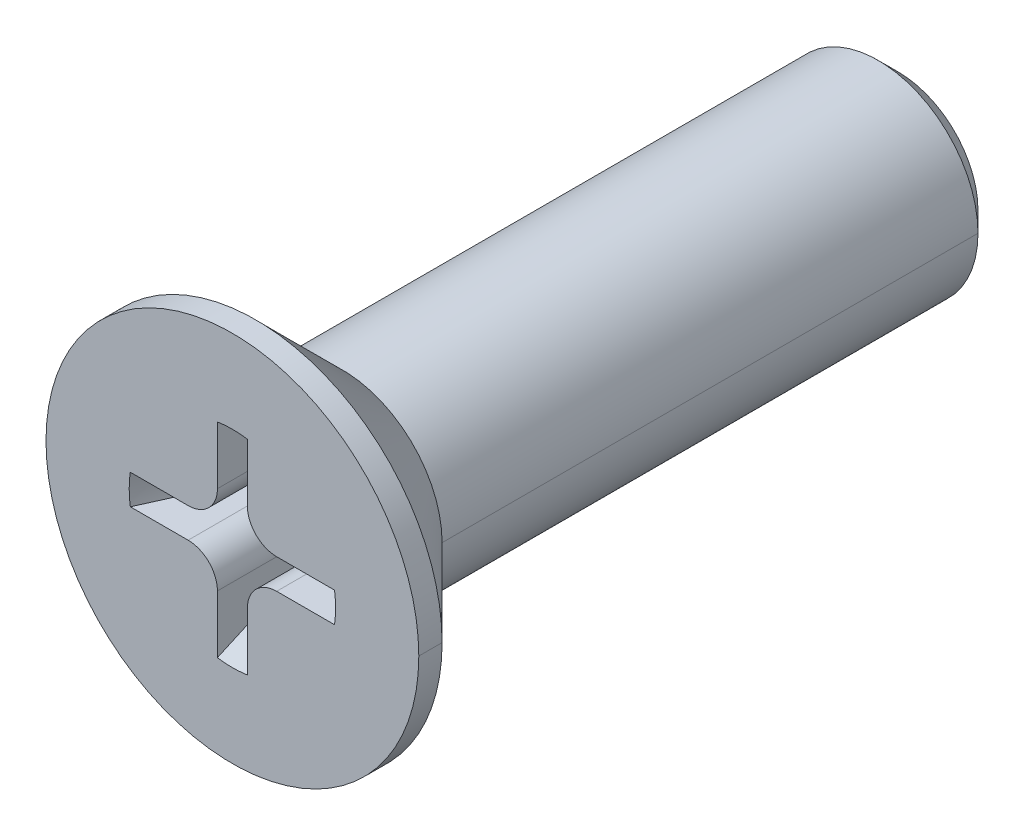
ISO-10303-21;
HEADER;
FILE_DESCRIPTION(('STEP AP214'),'2;1');
FILE_NAME('part.step','',(''),(''),'','','');
FILE_SCHEMA(('AUTOMOTIVE_DESIGN { 1 0 10303 214 1 1 1 1 }'));
ENDSEC;
DATA;
#1=APPLICATION_CONTEXT('core data for automotive mechanical design processes');
#2=APPLICATION_PROTOCOL_DEFINITION('international standard','automotive_design',2000,#1);
#3=PRODUCT_CONTEXT('',#1,'mechanical');
#4=PRODUCT('Part','Part','',(#3));
#5=PRODUCT_RELATED_PRODUCT_CATEGORY('part','',(#4));
#6=PRODUCT_DEFINITION_FORMATION('','',#4);
#7=PRODUCT_DEFINITION_CONTEXT('part definition',#1,'design');
#8=PRODUCT_DEFINITION('design','',#6,#7);
#9=PRODUCT_DEFINITION_SHAPE('','',#8);
#10=(LENGTH_UNIT() NAMED_UNIT(*) SI_UNIT(.MILLI.,.METRE.));
#11=(NAMED_UNIT(*) PLANE_ANGLE_UNIT() SI_UNIT($,.RADIAN.));
#12=(NAMED_UNIT(*) SI_UNIT($,.STERADIAN.) SOLID_ANGLE_UNIT());
#13=UNCERTAINTY_MEASURE_WITH_UNIT(LENGTH_MEASURE(1.E-05),#10,'distance_accuracy_value','');
#14=(GEOMETRIC_REPRESENTATION_CONTEXT(3) GLOBAL_UNCERTAINTY_ASSIGNED_CONTEXT((#13)) GLOBAL_UNIT_ASSIGNED_CONTEXT((#10,
#11,#12)) REPRESENTATION_CONTEXT('',''));
#15=CARTESIAN_POINT('',(0.,0.,0.));
#16=DIRECTION('',(0.,0.,1.));
#17=DIRECTION('',(1.,0.,0.));
#18=AXIS2_PLACEMENT_3D('',#15,#16,#17);
#19=CARTESIAN_POINT('',(0.,0.,1.65));
#20=DIRECTION('',(0.,0.,1.));
#21=DIRECTION('',(1.,0.,0.));
#22=AXIS2_PLACEMENT_3D('',#19,#20,#21);
#23=PLANE('',#22);
#24=CARTESIAN_POINT('',(0.665002947104029,-0.665002947104029,1.65));
#25=DIRECTION('',(0.,0.,-1.));
#26=DIRECTION('',(-0.999999999977569,6.69791883878349E-06,0.));
#27=AXIS2_PLACEMENT_3D('',#24,#25,#26);
#28=CIRCLE('',#27,0.440002947113898);
#29=CARTESIAN_POINT('',(0.225,-0.665,1.65));
#30=VERTEX_POINT('',#29);
#31=CARTESIAN_POINT('',(0.665,-0.225,1.65));
#32=VERTEX_POINT('',#31);
#33=EDGE_CURVE('E11',#30,#32,#28,.T.);
#34=ORIENTED_EDGE('',*,*,#33,.F.);
#35=DIRECTION('',(0.,1.,0.));
#36=VECTOR('',#35,1.);
#37=CARTESIAN_POINT('',(0.225,-1.5335824073065,1.65));
#38=LINE('',#37,#36);
#39=CARTESIAN_POINT('',(0.225000000000073,-1.53358240730625,1.6500000000001));
#40=VERTEX_POINT('',#39);
#41=EDGE_CURVE('E28',#40,#30,#38,.T.);
#42=ORIENTED_EDGE('',*,*,#41,.F.);
#43=CARTESIAN_POINT('',(-1.66239833898629E-07,2.27828530530161E-06,1.65));
#44=DIRECTION('',(0.,0.,1.));
#45=DIRECTION('',(1.07251348227272E-07,-1.,0.));
#46=AXIS2_PLACEMENT_3D('',#43,#44,#45);
#47=CIRCLE('',#46,1.55000227828531);
#48=CARTESIAN_POINT('',(0.,-1.55,1.65));
#49=VERTEX_POINT('',#48);
#50=EDGE_CURVE('E567',#49,#40,#47,.T.);
#51=ORIENTED_EDGE('',*,*,#50,.F.);
#52=CARTESIAN_POINT('',(1.6623987379727E-07,2.27828618171166E-06,1.65));
#53=DIRECTION('',(0.,0.,1.));
#54=DIRECTION('',(-0.145161184207195,-0.989408020282616,0.));
#55=AXIS2_PLACEMENT_3D('',#52,#53,#54);
#56=CIRCLE('',#55,1.55000227828619);
#57=CARTESIAN_POINT('',(-0.225,-1.53358240730663,1.65));
#58=VERTEX_POINT('',#57);
#59=EDGE_CURVE('E563',#58,#49,#56,.T.);
#60=ORIENTED_EDGE('',*,*,#59,.F.);
#61=DIRECTION('',(0.,-1.,0.));
#62=VECTOR('',#61,1.);
#63=CARTESIAN_POINT('',(-0.225,-0.665,1.65));
#64=LINE('',#63,#62);
#65=CARTESIAN_POINT('',(-0.225,-0.665,1.65));
#66=VERTEX_POINT('',#65);
#67=EDGE_CURVE('E558',#66,#58,#64,.T.);
#68=ORIENTED_EDGE('',*,*,#67,.F.);
#69=CARTESIAN_POINT('',(-0.665002947104029,-0.665002947104029,1.65));
#70=DIRECTION('',(0.,0.,-1.));
#71=DIRECTION('',(6.69791883878349E-06,0.999999999977569,0.));
#72=AXIS2_PLACEMENT_3D('',#69,#70,#71);
#73=CIRCLE('',#72,0.440002947113898);
#74=CARTESIAN_POINT('',(-0.665,-0.225,1.65));
#75=VERTEX_POINT('',#74);
#76=EDGE_CURVE('E550',#75,#66,#73,.T.);
#77=ORIENTED_EDGE('',*,*,#76,.F.);
#78=DIRECTION('',(1.,0.,0.));
#79=VECTOR('',#78,1.);
#80=CARTESIAN_POINT('',(-1.5335824073065,-0.225,1.65));
#81=LINE('',#80,#79);
#82=CARTESIAN_POINT('',(-1.53358240730626,-0.224999999999949,1.6500000000001));
#83=VERTEX_POINT('',#82);
#84=EDGE_CURVE('E559',#83,#75,#81,.T.);
#85=ORIENTED_EDGE('',*,*,#84,.F.);
#86=CARTESIAN_POINT('',(2.27828656429452E-06,1.66239900040166E-07,1.65));
#87=DIRECTION('',(0.,0.,1.));
#88=DIRECTION('',(-1.,-1.07251390899081E-07,0.));
#89=AXIS2_PLACEMENT_3D('',#86,#87,#88);
#90=CIRCLE('',#89,1.55000227828657);
#91=CARTESIAN_POINT('',(-1.55,0.,1.65));
#92=VERTEX_POINT('',#91);
#93=EDGE_CURVE('E611',#92,#83,#90,.T.);
#94=ORIENTED_EDGE('',*,*,#93,.F.);
#95=CARTESIAN_POINT('',(2.27828600740665E-06,-1.66239861106033E-07,1.65));
#96=DIRECTION('',(0.,0.,1.));
#97=DIRECTION('',(-0.989408020282614,0.145161184207203,0.));
#98=AXIS2_PLACEMENT_3D('',#95,#96,#97);
#99=CIRCLE('',#98,1.55000227828601);
#100=CARTESIAN_POINT('',(-1.53358240730663,0.225,1.65));
#101=VERTEX_POINT('',#100);
#102=EDGE_CURVE('E667',#101,#92,#99,.T.);
#103=ORIENTED_EDGE('',*,*,#102,.F.);
#104=DIRECTION('',(-1.,0.,0.));
#105=VECTOR('',#104,1.);
#106=CARTESIAN_POINT('',(-0.665,0.225,1.65));
#107=LINE('',#106,#105);
#108=CARTESIAN_POINT('',(-0.665,0.225,1.65));
#109=VERTEX_POINT('',#108);
#110=EDGE_CURVE('E190',#109,#101,#107,.T.);
#111=ORIENTED_EDGE('',*,*,#110,.F.);
#112=CARTESIAN_POINT('',(-0.665002947104029,0.665002947104029,1.65));
#113=DIRECTION('',(0.,0.,-1.));
#114=DIRECTION('',(0.999999999977569,-6.69791883954046E-06,0.));
#115=AXIS2_PLACEMENT_3D('',#112,#113,#114);
#116=CIRCLE('',#115,0.440002947113898);
#117=CARTESIAN_POINT('',(-0.225,0.665,1.65));
#118=VERTEX_POINT('',#117);
#119=EDGE_CURVE('E173',#118,#109,#116,.T.);
#120=ORIENTED_EDGE('',*,*,#119,.F.);
#121=DIRECTION('',(0.,-1.,0.));
#122=VECTOR('',#121,1.);
#123=CARTESIAN_POINT('',(-0.225,1.5335824073065,1.65));
#124=LINE('',#123,#122);
#125=CARTESIAN_POINT('',(-0.224999999999949,1.53358240730626,1.6500000000001));
#126=VERTEX_POINT('',#125);
#127=EDGE_CURVE('E180',#126,#118,#124,.T.);
#128=ORIENTED_EDGE('',*,*,#127,.F.);
#129=CARTESIAN_POINT('',(1.66239886884023E-07,-2.27828636334415E-06,1.65));
#130=DIRECTION('',(0.,0.,1.));
#131=DIRECTION('',(-1.07251382411274E-07,1.,0.));
#132=AXIS2_PLACEMENT_3D('',#129,#130,#131);
#133=CIRCLE('',#132,1.55000227828637);
#134=CARTESIAN_POINT('',(0.,1.55,1.65));
#135=VERTEX_POINT('',#134);
#136=EDGE_CURVE('E206',#135,#126,#133,.T.);
#137=ORIENTED_EDGE('',*,*,#136,.F.);
#138=CARTESIAN_POINT('',(-1.66239871111918E-07,-2.27828614463022E-06,1.65));
#139=DIRECTION('',(0.,0.,1.));
#140=DIRECTION('',(0.145161184207197,0.989408020282615,0.));
#141=AXIS2_PLACEMENT_3D('',#138,#139,#140);
#142=CIRCLE('',#141,1.55000227828615);
#143=CARTESIAN_POINT('',(0.225,1.53358240730663,1.65));
#144=VERTEX_POINT('',#143);
#145=EDGE_CURVE('E269',#144,#135,#142,.T.);
#146=ORIENTED_EDGE('',*,*,#145,.F.);
#147=DIRECTION('',(0.,1.,0.));
#148=VECTOR('',#147,1.);
#149=CARTESIAN_POINT('',(0.225,0.665,1.65));
#150=LINE('',#149,#148);
#151=CARTESIAN_POINT('',(0.225,0.665,1.65));
#152=VERTEX_POINT('',#151);
#153=EDGE_CURVE('E285',#152,#144,#150,.T.);
#154=ORIENTED_EDGE('',*,*,#153,.F.);
#155=CARTESIAN_POINT('',(0.665002947104029,0.665002947104029,1.65));
#156=DIRECTION('',(0.,0.,-1.));
#157=DIRECTION('',(-6.69791883878349E-06,-0.999999999977569,0.));
#158=AXIS2_PLACEMENT_3D('',#155,#156,#157);
#159=CIRCLE('',#158,0.440002947113898);
#160=CARTESIAN_POINT('',(0.665,0.225,1.65));
#161=VERTEX_POINT('',#160);
#162=EDGE_CURVE('E290',#161,#152,#159,.T.);
#163=ORIENTED_EDGE('',*,*,#162,.F.);
#164=DIRECTION('',(-1.,0.,0.));
#165=VECTOR('',#164,1.);
#166=CARTESIAN_POINT('',(1.5335824073065,0.225,1.65));
#167=LINE('',#166,#165);
#168=CARTESIAN_POINT('',(1.53358240730626,0.224999999999948,1.6500000000001));
#169=VERTEX_POINT('',#168);
#170=EDGE_CURVE('E751',#169,#161,#167,.T.);
#171=ORIENTED_EDGE('',*,*,#170,.F.);
#172=CARTESIAN_POINT('',(-2.27828557486376E-06,-1.66239852050776E-07,1.65));
#173=DIRECTION('',(0.,0.,1.));
#174=DIRECTION('',(1.,1.07251359938298E-07,0.));
#175=AXIS2_PLACEMENT_3D('',#172,#173,#174);
#176=CIRCLE('',#175,1.55000227828558);
#177=CARTESIAN_POINT('',(1.54999999999976,0.,1.6500000000001));
#178=VERTEX_POINT('',#177);
#179=EDGE_CURVE('E439',#178,#169,#176,.T.);
#180=ORIENTED_EDGE('',*,*,#179,.F.);
#181=CARTESIAN_POINT('',(-2.27828566146116E-06,1.66239860065198E-07,1.65));
#182=DIRECTION('',(0.,0.,1.));
#183=DIRECTION('',(0.98940802028261,-0.145161184207235,0.));
#184=AXIS2_PLACEMENT_3D('',#181,#182,#183);
#185=CIRCLE('',#184,1.55000227828567);
#186=CARTESIAN_POINT('',(1.53358240730663,-0.225,1.65));
#187=VERTEX_POINT('',#186);
#188=EDGE_CURVE('E452',#187,#178,#185,.T.);
#189=ORIENTED_EDGE('',*,*,#188,.F.);
#190=DIRECTION('',(1.,0.,0.));
#191=VECTOR('',#190,1.);
#192=CARTESIAN_POINT('',(0.665,-0.225,1.65));
#193=LINE('',#192,#191);
#194=EDGE_CURVE('E432',#32,#187,#193,.T.);
#195=ORIENTED_EDGE('',*,*,#194,.F.);
#196=EDGE_LOOP('',(#34,#42,#51,#60,#68,#77,#85,#94,#103,#111,#120,#128,#137,#146,#154,#163,#171,
#180,#189,#195));
#197=FACE_BOUND('',#196,.T.);
#198=CARTESIAN_POINT('',(0.,0.,1.65));
#199=DIRECTION('',(0.,0.,-1.));
#200=DIRECTION('',(1.,0.,0.));
#201=AXIS2_PLACEMENT_3D('',#198,#199,#200);
#202=CIRCLE('',#201,2.8);
#203=CARTESIAN_POINT('',(2.8,0.,1.65));
#204=VERTEX_POINT('',#203);
#205=CARTESIAN_POINT('',(-2.8,0.,1.65));
#206=VERTEX_POINT('',#205);
#207=EDGE_CURVE('E493',#204,#206,#202,.T.);
#208=ORIENTED_EDGE('',*,*,#207,.F.);
#209=CARTESIAN_POINT('',(0.,0.,1.65));
#210=DIRECTION('',(0.,0.,-1.));
#211=DIRECTION('',(-1.,0.,0.));
#212=AXIS2_PLACEMENT_3D('',#209,#210,#211);
#213=CIRCLE('',#212,2.8);
#214=EDGE_CURVE('E756',#206,#204,#213,.T.);
#215=ORIENTED_EDGE('',*,*,#214,.F.);
#216=EDGE_LOOP('',(#208,#215));
#217=FACE_BOUND('',#216,.T.);
#218=ADVANCED_FACE('F16',(#197,#217),#23,.T.);
#219=CARTESIAN_POINT('',(0.665,-0.665,-0.35));
#220=DIRECTION('',(0.,0.,1.));
#221=DIRECTION('',(1.,0.,0.));
#222=AXIS2_PLACEMENT_3D('',#219,#220,#221);
#223=CYLINDRICAL_SURFACE('',#222,0.44);
#224=CARTESIAN_POINT('',(0.664977290622323,-0.664977284049897,-0.35));
#225=DIRECTION('',(0.,0.,-1.));
#226=DIRECTION('',(0.707206493192012,0.707007055118304,0.));
#227=AXIS2_PLACEMENT_3D('',#224,#225,#226);
#228=ELLIPSE('',#227,0.439987856251335,0.439966630410505);
#229=CARTESIAN_POINT('',(0.227347754998727,-0.619607132219182,-0.35));
#230=VERTEX_POINT('',#229);
#231=CARTESIAN_POINT('',(0.61960713221919,-0.227347754998725,-0.35));
#232=VERTEX_POINT('',#231);
#233=EDGE_CURVE('E515',#230,#232,#228,.T.);
#234=ORIENTED_EDGE('',*,*,#233,.F.);
#235=CARTESIAN_POINT('',(0.225,-0.665,-0.25554435333));
#236=CARTESIAN_POINT('',(0.224997576697149,-0.659979084863247,-0.266245692639492));
#237=CARTESIAN_POINT('',(0.225172019705936,-0.649944923213804,-0.287458425731368));
#238=CARTESIAN_POINT('',(0.225948390210975,-0.634807892123544,-0.318947527727684));
#239=CARTESIAN_POINT('',(0.226825283704914,-0.624669289093572,-0.339712037566667));
#240=CARTESIAN_POINT('',(0.227347754998772,-0.619607132218977,-0.35));
#241=(BOUNDED_CURVE() B_SPLINE_CURVE(3,(#235,#236,#237,#238,#239,#240),.UNSPECIFIED.,.F.,
.F.) B_SPLINE_CURVE_WITH_KNOTS((4,1,1,4),(0.,0.338238737453003,0.671572101189784,1.),
.UNSPECIFIED.) CURVE() GEOMETRIC_REPRESENTATION_ITEM() RATIONAL_B_SPLINE_CURVE((1.,1.,1.,1.,1.,1.)) REPRESENTATION_ITEM(''));
#242=CARTESIAN_POINT('',(0.225000000000029,-0.664999999998303,-0.255544353333499));
#243=VERTEX_POINT('',#242);
#244=EDGE_CURVE('E353',#243,#230,#241,.T.);
#245=ORIENTED_EDGE('',*,*,#244,.F.);
#246=DIRECTION('',(0.,0.,-1.));
#247=VECTOR('',#246,1.);
#248=CARTESIAN_POINT('',(0.225,-0.665,1.65));
#249=LINE('',#248,#247);
#250=EDGE_CURVE('E715',#30,#243,#249,.T.);
#251=ORIENTED_EDGE('',*,*,#250,.F.);
#252=ORIENTED_EDGE('',*,*,#33,.T.);
#253=DIRECTION('',(0.,0.,1.));
#254=VECTOR('',#253,1.);
#255=CARTESIAN_POINT('',(0.665,-0.225,-0.25554435333));
#256=LINE('',#255,#254);
#257=CARTESIAN_POINT('',(0.665,-0.225,-0.255544353330121));
#258=VERTEX_POINT('',#257);
#259=EDGE_CURVE('E422',#258,#32,#256,.T.);
#260=ORIENTED_EDGE('',*,*,#259,.F.);
#261=CARTESIAN_POINT('',(0.619607132218976,-0.227347754998772,-0.35));
#262=CARTESIAN_POINT('',(0.624669289093211,-0.226825283704952,-0.33971203756746));
#263=CARTESIAN_POINT('',(0.634807892122837,-0.22594839021103,-0.318947527729279));
#264=CARTESIAN_POINT('',(0.649944923213095,-0.225172019705954,-0.287458425732962));
#265=CARTESIAN_POINT('',(0.659979084862893,-0.224997576697149,-0.266245692640291));
#266=CARTESIAN_POINT('',(0.665,-0.225,-0.25554435333));
#267=(BOUNDED_CURVE() B_SPLINE_CURVE(3,(#261,#262,#263,#264,#265,#266),.UNSPECIFIED.,.F.,
.F.) B_SPLINE_CURVE_WITH_KNOTS((4,1,1,4),(0.,0.328427898785266,0.66176126252203,1.),
.UNSPECIFIED.) CURVE() GEOMETRIC_REPRESENTATION_ITEM() RATIONAL_B_SPLINE_CURVE((1.,1.,1.,1.,1.,1.)) REPRESENTATION_ITEM(''));
#268=EDGE_CURVE('E435',#232,#258,#267,.T.);
#269=ORIENTED_EDGE('',*,*,#268,.F.);
#270=EDGE_LOOP('',(#234,#245,#251,#252,#260,#269));
#271=FACE_BOUND('',#270,.T.);
#272=ADVANCED_FACE('F324',(#271),#223,.T.);
#273=CARTESIAN_POINT('',(0.225,-0.665,-0.35));
#274=DIRECTION('',(1.,0.,0.));
#275=DIRECTION('',(0.,-1.,0.));
#276=AXIS2_PLACEMENT_3D('',#273,#274,#275);
#277=PLANE('',#276);
#278=ORIENTED_EDGE('',*,*,#41,.T.);
#279=ORIENTED_EDGE('',*,*,#250,.T.);
#280=CARTESIAN_POINT('',(0.225,-0.664999999994907,-0.255544353340496));
#281=CARTESIAN_POINT('',(0.225,-0.953818236801985,0.360428957635525));
#282=CARTESIAN_POINT('',(0.225,-1.53358240730574,1.65000000000032));
#283=B_SPLINE_CURVE_WITH_KNOTS('',2,(#280,#281,#282),.UNSPECIFIED.,.F.,.F.,(3,3),(0.,1.),.UNSPECIFIED.);
#284=EDGE_CURVE('E348',#243,#40,#283,.T.);
#285=ORIENTED_EDGE('',*,*,#284,.T.);
#286=EDGE_LOOP('',(#278,#279,#285));
#287=FACE_BOUND('',#286,.T.);
#288=ADVANCED_FACE('F325',(#287),#277,.F.);
#289=CARTESIAN_POINT('',(0.,0.,0.414044943820969));
#290=DIRECTION('',(0.,0.,1.));
#291=DIRECTION('',(1.,0.,0.));
#292=AXIS2_PLACEMENT_3D('',#289,#290,#291);
#293=CONICAL_SURFACE('',#292,1.,0.418688151438);
#294=ORIENTED_EDGE('',*,*,#244,.T.);
#295=CARTESIAN_POINT('',(0.,9.42262228875723E-06,-0.35));
#296=DIRECTION('',(0.,0.,1.));
#297=DIRECTION('',(-0.344461678646605,-0.938800379177577,0.));
#298=AXIS2_PLACEMENT_3D('',#295,#296,#297);
#299=CIRCLE('',#298,0.660008845953364);
#300=CARTESIAN_POINT('',(-0.227347754998727,-0.619607132219182,-0.35));
#301=VERTEX_POINT('',#300);
#302=EDGE_CURVE('E518',#301,#230,#299,.T.);
#303=ORIENTED_EDGE('',*,*,#302,.F.);
#304=CARTESIAN_POINT('',(-0.227347754998772,-0.619607132218976,-0.35));
#305=CARTESIAN_POINT('',(-0.226825283760521,-0.624669288381268,-0.339712037031239));
#306=CARTESIAN_POINT('',(-0.225948390346928,-0.634807890420636,-0.318947526519808));
#307=CARTESIAN_POINT('',(-0.225172019745341,-0.64994492151478,-0.287458424544833));
#308=CARTESIAN_POINT('',(-0.224997576715422,-0.659979084138568,-0.266245692105085));
#309=CARTESIAN_POINT('',(-0.225,-0.665,-0.25554435333));
#310=(BOUNDED_CURVE() B_SPLINE_CURVE(3,(#304,#305,#306,#307,#308,#309),.UNSPECIFIED.,.F.,
.F.) B_SPLINE_CURVE_WITH_KNOTS((4,1,1,4),(0.,0.328427903650265,0.66176126742425,1.),
.UNSPECIFIED.) CURVE() GEOMETRIC_REPRESENTATION_ITEM() RATIONAL_B_SPLINE_CURVE((1.,1.,1.,1.,1.,1.)) REPRESENTATION_ITEM(''));
#311=CARTESIAN_POINT('',(-0.225,-0.665,-0.255544353330121));
#312=VERTEX_POINT('',#311);
#313=EDGE_CURVE('E390',#301,#312,#310,.T.);
#314=ORIENTED_EDGE('',*,*,#313,.T.);
#315=CARTESIAN_POINT('',(-0.224999999999924,-0.664999999999773,-0.255544353330256));
#316=CARTESIAN_POINT('',(-0.225039547884392,-0.695465103759759,-0.190642415406481));
#317=CARTESIAN_POINT('',(-0.225087318401698,-0.725771368511061,-0.125666353264263));
#318=CARTESIAN_POINT('',(-0.225172119461064,-0.790511529117318,0.0138056822562831));
#319=CARTESIAN_POINT('',(-0.225206596269187,-0.824908244460088,0.0883189252409818));
#320=CARTESIAN_POINT('',(-0.225204503546371,-0.897841203921313,0.246862718118498));
#321=CARTESIAN_POINT('',(-0.225158400079613,-0.936350967044348,0.330905428113313));
#322=CARTESIAN_POINT('',(-0.225060729834554,-1.0174906776052,0.508514744546113));
#323=CARTESIAN_POINT('',(-0.22500913059015,-1.0600979976751,0.602091686644455));
#324=CARTESIAN_POINT('',(-0.224992586721939,-1.13435090645116,0.765576187106801));
#325=CARTESIAN_POINT('',(-0.225008980000664,-1.16603530920568,0.835466128966097));
#326=CARTESIAN_POINT('',(-0.225030966203751,-1.2322285782042,0.981666557942102));
#327=CARTESIAN_POINT('',(-0.225035434987474,-1.26673090169162,1.05798000694171));
#328=CARTESIAN_POINT('',(-0.225033200572356,-1.33855861884455,1.21702848478205));
#329=CARTESIAN_POINT('',(-0.225025530336253,-1.37587843341487,1.29976603261192));
#330=CARTESIAN_POINT('',(-0.225009317244668,-1.45333851249301,1.47166356355233));
#331=CARTESIAN_POINT('',(-0.225000752760716,-1.49347386583979,1.56082575994557));
#332=CARTESIAN_POINT('',(-0.224999999999854,-1.53358240730586,1.65000000000047));
#333=B_SPLINE_CURVE_WITH_KNOTS('',3,(#315,#316,#317,#318,#319,#320,#321,#322,#323,#324,#325,
#326,#327,#328,#329,#330,#331,#332),.UNSPECIFIED.,.F.,.F.,(4,2,2,2,2,2,2,2,4),(0.,
0.215088673233473,0.461295740035169,0.738632158647098,1.04709300891456,1.27730275845856,
1.528554337442,1.80084906647282,2.09418619594322),.UNSPECIFIED.);
#334=EDGE_CURVE('E384',#312,#58,#333,.T.);
#335=ORIENTED_EDGE('',*,*,#334,.T.);
#336=ORIENTED_EDGE('',*,*,#59,.T.);
#337=ORIENTED_EDGE('',*,*,#50,.T.);
#338=ORIENTED_EDGE('',*,*,#284,.F.);
#339=EDGE_LOOP('',(#294,#303,#314,#335,#336,#337,#338));
#340=FACE_BOUND('',#339,.T.);
#341=ADVANCED_FACE('F329',(#340),#293,.F.);
#342=CARTESIAN_POINT('',(-0.225,-1.55,-0.35));
#343=DIRECTION('',(-1.,0.,0.));
#344=DIRECTION('',(0.,1.,0.));
#345=AXIS2_PLACEMENT_3D('',#342,#343,#344);
#346=PLANE('',#345);
#347=DIRECTION('',(0.,0.,1.));
#348=VECTOR('',#347,1.);
#349=CARTESIAN_POINT('',(-0.225,-0.665,-0.25554435333));
#350=LINE('',#349,#348);
#351=EDGE_CURVE('E553',#312,#66,#350,.T.);
#352=ORIENTED_EDGE('',*,*,#351,.T.);
#353=ORIENTED_EDGE('',*,*,#67,.T.);
#354=ORIENTED_EDGE('',*,*,#334,.F.);
#355=EDGE_LOOP('',(#352,#353,#354));
#356=FACE_BOUND('',#355,.T.);
#357=ADVANCED_FACE('F363',(#356),#346,.F.);
#358=CARTESIAN_POINT('',(-0.665,-0.665,-0.35));
#359=DIRECTION('',(0.,0.,1.));
#360=DIRECTION('',(1.,0.,0.));
#361=AXIS2_PLACEMENT_3D('',#358,#359,#360);
#362=CYLINDRICAL_SURFACE('',#361,0.44);
#363=CARTESIAN_POINT('',(-0.664977284049885,-0.664977290622295,-0.35));
#364=DIRECTION('',(0.,0.,-1.));
#365=DIRECTION('',(-0.707007055318739,0.707206492991634,0.));
#366=AXIS2_PLACEMENT_3D('',#363,#364,#365);
#367=ELLIPSE('',#366,0.439987856251323,0.439966630410477);
#368=CARTESIAN_POINT('',(-0.61960713221919,-0.227347754998725,-0.35));
#369=VERTEX_POINT('',#368);
#370=EDGE_CURVE('E477',#369,#301,#367,.T.);
#371=ORIENTED_EDGE('',*,*,#370,.F.);
#372=CARTESIAN_POINT('',(-0.665,-0.225,-0.25554435333));
#373=CARTESIAN_POINT('',(-0.659979084863405,-0.224997576697145,-0.266245692639615));
#374=CARTESIAN_POINT('',(-0.649944923214177,-0.225172019705928,-0.287458425731638));
#375=CARTESIAN_POINT('',(-0.634807892123958,-0.225948390210943,-0.318947527727979));
#376=CARTESIAN_POINT('',(-0.624669289093746,-0.2268252837049,-0.339712037566797));
#377=CARTESIAN_POINT('',(-0.619607132218977,-0.227347754998772,-0.35));
#378=(BOUNDED_CURVE() B_SPLINE_CURVE(3,(#372,#373,#374,#375,#376,#377),.UNSPECIFIED.,.F.,
.F.) B_SPLINE_CURVE_WITH_KNOTS((4,1,1,4),(0.,0.338238737454223,0.671572101190959,1.),
.UNSPECIFIED.) CURVE() GEOMETRIC_REPRESENTATION_ITEM() RATIONAL_B_SPLINE_CURVE((1.,1.,1.,1.,1.,1.)) REPRESENTATION_ITEM(''));
#379=CARTESIAN_POINT('',(-0.665000000000185,-0.224999999999983,-0.255544353329524));
#380=VERTEX_POINT('',#379);
#381=EDGE_CURVE('E603',#380,#369,#378,.T.);
#382=ORIENTED_EDGE('',*,*,#381,.F.);
#383=DIRECTION('',(0.,0.,-1.));
#384=VECTOR('',#383,1.);
#385=CARTESIAN_POINT('',(-0.665,-0.225,1.65));
#386=LINE('',#385,#384);
#387=EDGE_CURVE('E555',#75,#380,#386,.T.);
#388=ORIENTED_EDGE('',*,*,#387,.F.);
#389=ORIENTED_EDGE('',*,*,#76,.T.);
#390=ORIENTED_EDGE('',*,*,#351,.F.);
#391=ORIENTED_EDGE('',*,*,#313,.F.);
#392=EDGE_LOOP('',(#371,#382,#388,#389,#390,#391));
#393=FACE_BOUND('',#392,.T.);
#394=ADVANCED_FACE('F401',(#393),#362,.T.);
#395=CARTESIAN_POINT('',(-0.665,-0.225,-0.35));
#396=DIRECTION('',(0.,-1.,0.));
#397=DIRECTION('',(-1.,0.,0.));
#398=AXIS2_PLACEMENT_3D('',#395,#396,#397);
#399=PLANE('',#398);
#400=ORIENTED_EDGE('',*,*,#84,.T.);
#401=ORIENTED_EDGE('',*,*,#387,.T.);
#402=CARTESIAN_POINT('',(-0.665000000000556,-0.225,-0.255544353328571));
#403=CARTESIAN_POINT('',(-0.953818236804416,-0.225,0.360428957641391));
#404=CARTESIAN_POINT('',(-1.53358240730579,-0.225,1.65000000000032));
#405=B_SPLINE_CURVE_WITH_KNOTS('',2,(#402,#403,#404),.UNSPECIFIED.,.F.,.F.,(3,3),(0.,1.),.UNSPECIFIED.);
#406=EDGE_CURVE('E587',#380,#83,#405,.T.);
#407=ORIENTED_EDGE('',*,*,#406,.T.);
#408=EDGE_LOOP('',(#400,#401,#407));
#409=FACE_BOUND('',#408,.T.);
#410=ADVANCED_FACE('F320',(#409),#399,.F.);
#411=CARTESIAN_POINT('',(0.,0.,0.414044943820969));
#412=DIRECTION('',(0.,0.,1.));
#413=DIRECTION('',(1.,0.,0.));
#414=AXIS2_PLACEMENT_3D('',#411,#412,#413);
#415=CONICAL_SURFACE('',#414,1.,0.418688151438);
#416=ORIENTED_EDGE('',*,*,#93,.T.);
#417=ORIENTED_EDGE('',*,*,#406,.F.);
#418=ORIENTED_EDGE('',*,*,#381,.T.);
#419=CARTESIAN_POINT('',(5.59334874616901E-06,9.93770143703499E-07,-0.35));
#420=DIRECTION('',(0.,0.,1.));
#421=DIRECTION('',(-0.999999999998867,-1.50569957848413E-06,0.));
#422=AXIS2_PLACEMENT_3D('',#419,#420,#421);
#423=CIRCLE('',#422,0.660005593349494);
#424=CARTESIAN_POINT('',(-0.66,0.,-0.35));
#425=VERTEX_POINT('',#424);
#426=EDGE_CURVE('E474',#425,#369,#423,.T.);
#427=ORIENTED_EDGE('',*,*,#426,.F.);
#428=CARTESIAN_POINT('',(5.59334928773581E-06,-9.93770240036163E-07,-0.35));
#429=DIRECTION('',(0.,0.,1.));
#430=DIRECTION('',(-0.93879920384246,0.344464881903458,0.));
#431=AXIS2_PLACEMENT_3D('',#428,#429,#430);
#432=CIRCLE('',#431,0.660005593350036);
#433=CARTESIAN_POINT('',(-0.61960713221919,0.227347754998725,-0.35));
#434=VERTEX_POINT('',#433);
#435=EDGE_CURVE('E468',#434,#425,#432,.T.);
#436=ORIENTED_EDGE('',*,*,#435,.F.);
#437=CARTESIAN_POINT('',(-0.619607132218976,0.227347754998772,-0.35));
#438=CARTESIAN_POINT('',(-0.624669289093226,0.22682528370495,-0.339712037567471));
#439=CARTESIAN_POINT('',(-0.634807892122873,0.225948390211027,-0.318947527729304));
#440=CARTESIAN_POINT('',(-0.649944923213123,0.225172019705953,-0.287458425732984));
#441=CARTESIAN_POINT('',(-0.659979084862905,0.224997576697148,-0.266245692640301));
#442=CARTESIAN_POINT('',(-0.665,0.225,-0.25554435333));
#443=(BOUNDED_CURVE() B_SPLINE_CURVE(3,(#437,#438,#439,#440,#441,#442),.UNSPECIFIED.,.F.,
.F.) B_SPLINE_CURVE_WITH_KNOTS((4,1,1,4),(0.,0.328427898785164,0.661761262521922,1.),
.UNSPECIFIED.) CURVE() GEOMETRIC_REPRESENTATION_ITEM() RATIONAL_B_SPLINE_CURVE((1.,1.,1.,1.,1.,1.)) REPRESENTATION_ITEM(''));
#444=CARTESIAN_POINT('',(-0.665,0.225,-0.255544353330121));
#445=VERTEX_POINT('',#444);
#446=EDGE_CURVE('E612',#434,#445,#443,.T.);
#447=ORIENTED_EDGE('',*,*,#446,.T.);
#448=CARTESIAN_POINT('',(-0.664999999999774,0.224999999999922,-0.255544353330256));
#449=CARTESIAN_POINT('',(-0.695465103761088,0.225039547884359,-0.190642415403678));
#450=CARTESIAN_POINT('',(-0.725771368513724,0.225087318401547,-0.125666353258659));
#451=CARTESIAN_POINT('',(-0.790511529121772,0.225172119460607,0.0138056822656223));
#452=CARTESIAN_POINT('',(-0.824908244465006,0.22520659626853,0.0883189252512523));
#453=CARTESIAN_POINT('',(-0.897841203926261,0.225204503545415,0.246862718128763));
#454=CARTESIAN_POINT('',(-0.936350967048863,0.225158400078574,0.330905428122642));
#455=CARTESIAN_POINT('',(-1.01749067760791,0.225060729833784,0.508514744551711));
#456=CARTESIAN_POINT('',(-1.06009799767645,0.225009130589783,0.602091686647258));
#457=CARTESIAN_POINT('',(-1.13435090645409,0.224992586722209,0.765576187113372));
#458=CARTESIAN_POINT('',(-1.16603530921154,0.225008980001189,0.83546612897924));
#459=CARTESIAN_POINT('',(-1.23222857821397,0.225030966204482,0.981666557964005));
#460=CARTESIAN_POINT('',(-1.26673090170239,0.225035434988126,1.0579800069658));
#461=CARTESIAN_POINT('',(-1.33855861885534,0.225033200572799,1.21702848480614));
#462=CARTESIAN_POINT('',(-1.37587843342469,0.225025530336564,1.29976603263382));
#463=CARTESIAN_POINT('',(-1.45333851249891,0.225009317244753,1.47166356356547));
#464=CARTESIAN_POINT('',(-1.49347386584275,0.225000752760711,1.56082575995214));
#465=CARTESIAN_POINT('',(-1.53358240730586,0.224999999999844,1.65000000000047));
#466=B_SPLINE_CURVE_WITH_KNOTS('',3,(#448,#449,#450,#451,#452,#453,#454,#455,#456,#457,#458,
#459,#460,#461,#462,#463,#464,#465),.UNSPECIFIED.,.F.,.F.,(4,2,2,2,2,2,2,2,4),(0.,
0.215088673242779,0.461295740047595,0.738632158656429,1.04709300891456,1.27730275848015,
1.52855433747079,1.80084906649442,2.09418619594322),.UNSPECIFIED.);
#467=EDGE_CURVE('E636',#445,#101,#466,.T.);
#468=ORIENTED_EDGE('',*,*,#467,.T.);
#469=ORIENTED_EDGE('',*,*,#102,.T.);
#470=EDGE_LOOP('',(#416,#417,#418,#427,#436,#447,#468,#469));
#471=FACE_BOUND('',#470,.T.);
#472=ADVANCED_FACE('F364',(#471),#415,.F.);
#473=CARTESIAN_POINT('',(-1.55,0.225,-0.35));
#474=DIRECTION('',(0.,1.,0.));
#475=DIRECTION('',(1.,0.,0.));
#476=AXIS2_PLACEMENT_3D('',#473,#474,#475);
#477=PLANE('',#476);
#478=DIRECTION('',(0.,0.,1.));
#479=VECTOR('',#478,1.);
#480=CARTESIAN_POINT('',(-0.665,0.225,-0.25554435333));
#481=LINE('',#480,#479);
#482=EDGE_CURVE('E661',#445,#109,#481,.T.);
#483=ORIENTED_EDGE('',*,*,#482,.T.);
#484=ORIENTED_EDGE('',*,*,#110,.T.);
#485=ORIENTED_EDGE('',*,*,#467,.F.);
#486=EDGE_LOOP('',(#483,#484,#485));
#487=FACE_BOUND('',#486,.T.);
#488=ADVANCED_FACE('F412',(#487),#477,.F.);
#489=CARTESIAN_POINT('',(-0.665,0.665,-0.35));
#490=DIRECTION('',(0.,0.,1.));
#491=DIRECTION('',(1.,0.,0.));
#492=AXIS2_PLACEMENT_3D('',#489,#490,#491);
#493=CYLINDRICAL_SURFACE('',#492,0.44);
#494=CARTESIAN_POINT('',(-0.664977290622325,0.6649772840499,-0.35));
#495=DIRECTION('',(0.,0.,-1.));
#496=DIRECTION('',(0.707206493193319,0.707007055116997,0.));
#497=AXIS2_PLACEMENT_3D('',#494,#495,#496);
#498=ELLIPSE('',#497,0.439987856251336,0.439966630410509);
#499=CARTESIAN_POINT('',(-0.227347754998727,0.619607132219182,-0.35));
#500=VERTEX_POINT('',#499);
#501=EDGE_CURVE('E768',#500,#434,#498,.T.);
#502=ORIENTED_EDGE('',*,*,#501,.F.);
#503=CARTESIAN_POINT('',(-0.225,0.665,-0.25554435333));
#504=CARTESIAN_POINT('',(-0.22499757669745,0.659979084851298,-0.266245692630642));
#505=CARTESIAN_POINT('',(-0.225172019706584,0.649944923185782,-0.287458425711728));
#506=CARTESIAN_POINT('',(-0.225948390213228,0.634807892095306,-0.318947527707617));
#507=CARTESIAN_POINT('',(-0.226825283705835,0.62466928908176,-0.339712037557772));
#508=CARTESIAN_POINT('',(-0.227347754998772,0.619607132218977,-0.35));
#509=(BOUNDED_CURVE() B_SPLINE_CURVE(3,(#503,#504,#505,#506,#507,#508),.UNSPECIFIED.,.F.,
.F.) B_SPLINE_CURVE_WITH_KNOTS((4,1,1,4),(0.,0.338238737371578,0.671572101109111,1.),
.UNSPECIFIED.) CURVE() GEOMETRIC_REPRESENTATION_ITEM() RATIONAL_B_SPLINE_CURVE((1.,1.,1.,1.,1.,1.)) REPRESENTATION_ITEM(''));
#510=CARTESIAN_POINT('',(-0.224999999999983,0.66500000000018,-0.255544353329535));
#511=VERTEX_POINT('',#510);
#512=EDGE_CURVE('E198',#511,#500,#509,.T.);
#513=ORIENTED_EDGE('',*,*,#512,.F.);
#514=DIRECTION('',(0.,0.,-1.));
#515=VECTOR('',#514,1.);
#516=CARTESIAN_POINT('',(-0.225,0.665,1.65));
#517=LINE('',#516,#515);
#518=EDGE_CURVE('E181',#118,#511,#517,.T.);
#519=ORIENTED_EDGE('',*,*,#518,.F.);
#520=ORIENTED_EDGE('',*,*,#119,.T.);
#521=ORIENTED_EDGE('',*,*,#482,.F.);
#522=ORIENTED_EDGE('',*,*,#446,.F.);
#523=EDGE_LOOP('',(#502,#513,#519,#520,#521,#522));
#524=FACE_BOUND('',#523,.T.);
#525=ADVANCED_FACE('F196',(#524),#493,.T.);
#526=CARTESIAN_POINT('',(-0.225,0.665,-0.35));
#527=DIRECTION('',(-1.,0.,0.));
#528=DIRECTION('',(0.,1.,0.));
#529=AXIS2_PLACEMENT_3D('',#526,#527,#528);
#530=PLANE('',#529);
#531=ORIENTED_EDGE('',*,*,#127,.T.);
#532=ORIENTED_EDGE('',*,*,#518,.T.);
#533=CARTESIAN_POINT('',(-0.225,0.66500000000054,-0.255544353328605));
#534=CARTESIAN_POINT('',(-0.225,0.953818236804248,0.360428957641035));
#535=CARTESIAN_POINT('',(-0.225,1.53358240730579,1.65000000000032));
#536=B_SPLINE_CURVE_WITH_KNOTS('',2,(#533,#534,#535),.UNSPECIFIED.,.F.,.F.,(3,3),(0.,1.),.UNSPECIFIED.);
#537=EDGE_CURVE('E183',#511,#126,#536,.T.);
#538=ORIENTED_EDGE('',*,*,#537,.T.);
#539=EDGE_LOOP('',(#531,#532,#538));
#540=FACE_BOUND('',#539,.T.);
#541=ADVANCED_FACE('F18',(#540),#530,.F.);
#542=CARTESIAN_POINT('',(0.,0.,0.414044943820969));
#543=DIRECTION('',(0.,0.,1.));
#544=DIRECTION('',(1.,0.,0.));
#545=AXIS2_PLACEMENT_3D('',#542,#543,#544);
#546=CONICAL_SURFACE('',#545,1.,0.418688151438);
#547=ORIENTED_EDGE('',*,*,#136,.T.);
#548=ORIENTED_EDGE('',*,*,#537,.F.);
#549=ORIENTED_EDGE('',*,*,#512,.T.);
#550=CARTESIAN_POINT('',(0.,-9.42262228786905E-06,-0.35));
#551=DIRECTION('',(0.,0.,1.));
#552=DIRECTION('',(0.344461678646606,0.938800379177577,0.));
#553=AXIS2_PLACEMENT_3D('',#550,#551,#552);
#554=CIRCLE('',#553,0.660008845953363);
#555=CARTESIAN_POINT('',(0.227347754998727,0.619607132219182,-0.35));
#556=VERTEX_POINT('',#555);
#557=EDGE_CURVE('E514',#556,#500,#554,.T.);
#558=ORIENTED_EDGE('',*,*,#557,.F.);
#559=CARTESIAN_POINT('',(0.227347754998772,0.619607132218977,-0.35));
#560=CARTESIAN_POINT('',(0.226825283704951,0.624669289093219,-0.339712037567466));
#561=CARTESIAN_POINT('',(0.225948390211028,0.634807892122857,-0.318947527729293));
#562=CARTESIAN_POINT('',(0.225172019705954,0.649944923213109,-0.287458425732974));
#563=CARTESIAN_POINT('',(0.224997576697148,0.659979084862899,-0.266245692640296));
#564=CARTESIAN_POINT('',(0.225,0.665,-0.25554435333));
#565=(BOUNDED_CURVE() B_SPLINE_CURVE(3,(#559,#560,#561,#562,#563,#564),.UNSPECIFIED.,.F.,
.F.) B_SPLINE_CURVE_WITH_KNOTS((4,1,1,4),(0.,0.328427898785208,0.661761262521966,1.),
.UNSPECIFIED.) CURVE() GEOMETRIC_REPRESENTATION_ITEM() RATIONAL_B_SPLINE_CURVE((1.,1.,1.,1.,1.,1.)) REPRESENTATION_ITEM(''));
#566=CARTESIAN_POINT('',(0.225,0.665,-0.255544353330121));
#567=VERTEX_POINT('',#566);
#568=EDGE_CURVE('E256',#556,#567,#565,.T.);
#569=ORIENTED_EDGE('',*,*,#568,.T.);
#570=CARTESIAN_POINT('',(0.224999999999924,0.664999999999773,-0.255544353330256));
#571=CARTESIAN_POINT('',(0.225039547884361,0.695465103761088,-0.190642415403678));
#572=CARTESIAN_POINT('',(0.225087318401549,0.725771368513723,-0.125666353258659));
#573=CARTESIAN_POINT('',(0.225172119460608,0.790511529121771,0.0138056822656223));
#574=CARTESIAN_POINT('',(0.225206596268531,0.824908244465006,0.0883189252512523));
#575=CARTESIAN_POINT('',(0.225204503545416,0.897841203926261,0.246862718128763));
#576=CARTESIAN_POINT('',(0.225158400078575,0.936350967048863,0.330905428122642));
#577=CARTESIAN_POINT('',(0.225060729833786,1.01749067760791,0.508514744551711));
#578=CARTESIAN_POINT('',(0.225009130589786,1.06009799767645,0.602091686647258));
#579=CARTESIAN_POINT('',(0.224992586722211,1.13435090645409,0.765576187113374));
#580=CARTESIAN_POINT('',(0.225008980001191,1.16603530921154,0.835466128979243));
#581=CARTESIAN_POINT('',(0.225030966204483,1.23222857821397,0.981666557964011));
#582=CARTESIAN_POINT('',(0.225035434988127,1.2667309017024,1.0579800069658));
#583=CARTESIAN_POINT('',(0.225033200572799,1.33855861885534,1.21702848480614));
#584=CARTESIAN_POINT('',(0.225025530336564,1.37587843342469,1.29976603263382));
#585=CARTESIAN_POINT('',(0.225009317244753,1.45333851249891,1.47166356356547));
#586=CARTESIAN_POINT('',(0.225000752760711,1.49347386584275,1.56082575995214));
#587=CARTESIAN_POINT('',(0.224999999999846,1.53358240730586,1.65000000000047));
#588=B_SPLINE_CURVE_WITH_KNOTS('',3,(#570,#571,#572,#573,#574,#575,#576,#577,#578,#579,#580,
#581,#582,#583,#584,#585,#586,#587),.UNSPECIFIED.,.F.,.F.,(4,2,2,2,2,2,2,2,4),(0.,
0.215088673242779,0.461295740047596,0.738632158656429,1.04709300891456,1.27730275848015,
1.5285543374708,1.80084906649443,2.09418619594322),.UNSPECIFIED.);
#589=EDGE_CURVE('E226',#567,#144,#588,.T.);
#590=ORIENTED_EDGE('',*,*,#589,.T.);
#591=ORIENTED_EDGE('',*,*,#145,.T.);
#592=EDGE_LOOP('',(#547,#548,#549,#558,#569,#590,#591));
#593=FACE_BOUND('',#592,.T.);
#594=ADVANCED_FACE('F232',(#593),#546,.F.);
#595=CARTESIAN_POINT('',(0.225,1.55,-0.35));
#596=DIRECTION('',(1.,0.,0.));
#597=DIRECTION('',(0.,-1.,0.));
#598=AXIS2_PLACEMENT_3D('',#595,#596,#597);
#599=PLANE('',#598);
#600=DIRECTION('',(0.,0.,1.));
#601=VECTOR('',#600,1.);
#602=CARTESIAN_POINT('',(0.225,0.665,-0.25554435333));
#603=LINE('',#602,#601);
#604=EDGE_CURVE('E278',#567,#152,#603,.T.);
#605=ORIENTED_EDGE('',*,*,#604,.T.);
#606=ORIENTED_EDGE('',*,*,#153,.T.);
#607=ORIENTED_EDGE('',*,*,#589,.F.);
#608=EDGE_LOOP('',(#605,#606,#607));
#609=FACE_BOUND('',#608,.T.);
#610=ADVANCED_FACE('F241',(#609),#599,.F.);
#611=CARTESIAN_POINT('',(0.665,0.665,-0.35));
#612=DIRECTION('',(0.,0.,1.));
#613=DIRECTION('',(1.,0.,0.));
#614=AXIS2_PLACEMENT_3D('',#611,#612,#613);
#615=CYLINDRICAL_SURFACE('',#614,0.44);
#616=CARTESIAN_POINT('',(0.664977284049893,0.664977290622299,-0.35));
#617=DIRECTION('',(0.,0.,-1.));
#618=DIRECTION('',(-0.707007055354392,0.707206492955991,0.));
#619=AXIS2_PLACEMENT_3D('',#616,#617,#618);
#620=ELLIPSE('',#619,0.439987856251326,0.439966630410485);
#621=CARTESIAN_POINT('',(0.61960713221919,0.227347754998725,-0.35));
#622=VERTEX_POINT('',#621);
#623=EDGE_CURVE('E510',#622,#556,#620,.T.);
#624=ORIENTED_EDGE('',*,*,#623,.F.);
#625=CARTESIAN_POINT('',(0.665,0.225,-0.25554435333));
#626=CARTESIAN_POINT('',(0.65997908486331,0.224997576697148,-0.266245692639542));
#627=CARTESIAN_POINT('',(0.649944923213953,0.225172019705932,-0.287458425731477));
#628=CARTESIAN_POINT('',(0.634807892123717,0.225948390210962,-0.318947527727807));
#629=CARTESIAN_POINT('',(0.624669289093644,0.226825283704908,-0.339712037566721));
#630=CARTESIAN_POINT('',(0.619607132218976,0.227347754998772,-0.35));
#631=(BOUNDED_CURVE() B_SPLINE_CURVE(3,(#625,#626,#627,#628,#629,#630),.UNSPECIFIED.,.F.,
.F.) B_SPLINE_CURVE_WITH_KNOTS((4,1,1,4),(0.,0.338238737453512,0.671572101190267,1.),
.UNSPECIFIED.) CURVE() GEOMETRIC_REPRESENTATION_ITEM() RATIONAL_B_SPLINE_CURVE((1.,1.,1.,1.,1.,1.)) REPRESENTATION_ITEM(''));
#632=CARTESIAN_POINT('',(0.665000000000185,0.224999999999983,-0.255544353329525));
#633=VERTEX_POINT('',#632);
#634=EDGE_CURVE('E710',#633,#622,#631,.T.);
#635=ORIENTED_EDGE('',*,*,#634,.F.);
#636=DIRECTION('',(0.,0.,-1.));
#637=VECTOR('',#636,1.);
#638=CARTESIAN_POINT('',(0.665,0.225,1.65));
#639=LINE('',#638,#637);
#640=EDGE_CURVE('E709',#161,#633,#639,.T.);
#641=ORIENTED_EDGE('',*,*,#640,.F.);
#642=ORIENTED_EDGE('',*,*,#162,.T.);
#643=ORIENTED_EDGE('',*,*,#604,.F.);
#644=ORIENTED_EDGE('',*,*,#568,.F.);
#645=EDGE_LOOP('',(#624,#635,#641,#642,#643,#644));
#646=FACE_BOUND('',#645,.T.);
#647=ADVANCED_FACE('F319',(#646),#615,.T.);
#648=CARTESIAN_POINT('',(0.665,0.225,-0.35));
#649=DIRECTION('',(0.,1.,0.));
#650=DIRECTION('',(1.,0.,0.));
#651=AXIS2_PLACEMENT_3D('',#648,#649,#650);
#652=PLANE('',#651);
#653=ORIENTED_EDGE('',*,*,#170,.T.);
#654=ORIENTED_EDGE('',*,*,#640,.T.);
#655=CARTESIAN_POINT('',(0.665000000000555,0.225,-0.255544353328573));
#656=CARTESIAN_POINT('',(0.953818236804245,0.225,0.360428957641025));
#657=CARTESIAN_POINT('',(1.53358240730579,0.225,1.65000000000032));
#658=B_SPLINE_CURVE_WITH_KNOTS('',2,(#655,#656,#657),.UNSPECIFIED.,.F.,.F.,(3,3),(0.,1.),.UNSPECIFIED.);
#659=EDGE_CURVE('E302',#633,#169,#658,.T.);
#660=ORIENTED_EDGE('',*,*,#659,.T.);
#661=EDGE_LOOP('',(#653,#654,#660));
#662=FACE_BOUND('',#661,.T.);
#663=ADVANCED_FACE('F308',(#662),#652,.F.);
#664=CARTESIAN_POINT('',(0.,0.,0.414044943820969));
#665=DIRECTION('',(0.,0.,1.));
#666=DIRECTION('',(1.,0.,0.));
#667=AXIS2_PLACEMENT_3D('',#664,#665,#666);
#668=CONICAL_SURFACE('',#667,1.,0.418688151438);
#669=ORIENTED_EDGE('',*,*,#659,.F.);
#670=ORIENTED_EDGE('',*,*,#634,.T.);
#671=CARTESIAN_POINT('',(-5.59334874583595E-06,-9.93770143675743E-07,-0.35));
#672=DIRECTION('',(0.,0.,1.));
#673=DIRECTION('',(0.999999999998867,1.50569957844207E-06,0.));
#674=AXIS2_PLACEMENT_3D('',#671,#672,#673);
#675=CIRCLE('',#674,0.660005593349494);
#676=CARTESIAN_POINT('',(0.66,0.,-0.35));
#677=VERTEX_POINT('',#676);
#678=EDGE_CURVE('E109',#677,#622,#675,.T.);
#679=ORIENTED_EDGE('',*,*,#678,.F.);
#680=DIRECTION('',(-0.406562268122869,0.,-0.913623074434303));
#681=VECTOR('',#680,1.);
#682=CARTESIAN_POINT('',(1.54999999999928,0.,1.65000000000032));
#683=LINE('',#682,#681);
#684=EDGE_CURVE('E431',#178,#677,#683,.T.);
#685=ORIENTED_EDGE('',*,*,#684,.F.);
#686=ORIENTED_EDGE('',*,*,#179,.T.);
#687=EDGE_LOOP('',(#669,#670,#679,#685,#686));
#688=FACE_BOUND('',#687,.T.);
#689=ADVANCED_FACE('F318',(#688),#668,.F.);
#690=CARTESIAN_POINT('',(0.,0.,0.414044943820969));
#691=DIRECTION('',(0.,0.,1.));
#692=DIRECTION('',(1.,0.,0.));
#693=AXIS2_PLACEMENT_3D('',#690,#691,#692);
#694=CONICAL_SURFACE('',#693,1.,0.418688151438);
#695=CARTESIAN_POINT('',(-5.59334929328692E-06,9.93770241014547E-07,-0.35));
#696=DIRECTION('',(0.,0.,1.));
#697=DIRECTION('',(0.938799203842461,-0.344464881903456,0.));
#698=AXIS2_PLACEMENT_3D('',#695,#696,#697);
#699=CIRCLE('',#698,0.660005593350042);
#700=EDGE_CURVE('E519',#232,#677,#699,.T.);
#701=ORIENTED_EDGE('',*,*,#700,.F.);
#702=ORIENTED_EDGE('',*,*,#268,.T.);
#703=CARTESIAN_POINT('',(0.664999999999774,-0.224999999999921,-0.255544353330256));
#704=CARTESIAN_POINT('',(0.695465103762393,-0.225039547884327,-0.190642415400929));
#705=CARTESIAN_POINT('',(0.725771368516336,-0.225087318401401,-0.125666353253163));
#706=CARTESIAN_POINT('',(0.79051152912614,-0.225172119460158,0.0138056822747828));
#707=CARTESIAN_POINT('',(0.82490824446983,-0.225206596267887,0.0883189252613261));
#708=CARTESIAN_POINT('',(0.897841203931115,-0.225204503544477,0.246862718138833));
#709=CARTESIAN_POINT('',(0.936350967053293,-0.225158400077554,0.330905428131792));
#710=CARTESIAN_POINT('',(1.01749067761058,-0.225060729833028,0.508514744557201));
#711=CARTESIAN_POINT('',(1.06009799767777,-0.225009130589424,0.602091686650008));
#712=CARTESIAN_POINT('',(1.13435090645696,-0.224992586722473,0.765576187119822));
#713=CARTESIAN_POINT('',(1.16603530921729,-0.225008980001703,0.835466128992139));
#714=CARTESIAN_POINT('',(1.23222857822356,-0.225030966205198,0.981666557985503));
#715=CARTESIAN_POINT('',(1.26673090171297,-0.225035434988765,1.05798000698944));
#716=CARTESIAN_POINT('',(1.33855861886593,-0.225033200573236,1.21702848482978));
#717=CARTESIAN_POINT('',(1.37587843343433,-0.225025530336873,1.29976603265531));
#718=CARTESIAN_POINT('',(1.4533385125047,-0.225009317244844,1.47166356357836));
#719=CARTESIAN_POINT('',(1.49347386584565,-0.225000752760716,1.56082575995858));
#720=CARTESIAN_POINT('',(1.53358240730586,-0.224999999999847,1.65000000000047));
#721=B_SPLINE_CURVE_WITH_KNOTS('',3,(#703,#704,#705,#706,#707,#708,#709,#710,#711,#712,#713,
#714,#715,#716,#717,#718,#719,#720),.UNSPECIFIED.,.F.,.F.,(4,2,2,2,2,2,2,2,4),(0.,
0.215088673251906,0.461295740059784,0.738632158665581,1.04709300891457,1.27730275850133,
1.52855433749905,1.80084906651562,2.09418619594322),.UNSPECIFIED.);
#722=EDGE_CURVE('E440',#258,#187,#721,.T.);
#723=ORIENTED_EDGE('',*,*,#722,.T.);
#724=ORIENTED_EDGE('',*,*,#188,.T.);
#725=ORIENTED_EDGE('',*,*,#684,.T.);
#726=EDGE_LOOP('',(#701,#702,#723,#724,#725));
#727=FACE_BOUND('',#726,.T.);
#728=ADVANCED_FACE('F330',(#727),#694,.F.);
#729=CARTESIAN_POINT('',(1.55,-0.225,-0.35));
#730=DIRECTION('',(0.,-1.,0.));
#731=DIRECTION('',(-1.,0.,0.));
#732=AXIS2_PLACEMENT_3D('',#729,#730,#731);
#733=PLANE('',#732);
#734=ORIENTED_EDGE('',*,*,#259,.T.);
#735=ORIENTED_EDGE('',*,*,#194,.T.);
#736=ORIENTED_EDGE('',*,*,#722,.F.);
#737=EDGE_LOOP('',(#734,#735,#736));
#738=FACE_BOUND('',#737,.T.);
#739=ADVANCED_FACE('F407',(#738),#733,.F.);
#740=CARTESIAN_POINT('',(0.,0.,1.65));
#741=DIRECTION('',(0.,0.,1.));
#742=DIRECTION('',(1.,0.,0.));
#743=AXIS2_PLACEMENT_3D('',#740,#741,#742);
#744=CYLINDRICAL_SURFACE('',#743,2.8);
#745=DIRECTION('',(0.,0.,1.));
#746=VECTOR('',#745,1.);
#747=CARTESIAN_POINT('',(2.8,0.,1.3));
#748=LINE('',#747,#746);
#749=CARTESIAN_POINT('',(2.8,0.,1.3));
#750=VERTEX_POINT('',#749);
#751=EDGE_CURVE('E450',#750,#204,#748,.T.);
#752=ORIENTED_EDGE('',*,*,#751,.T.);
#753=ORIENTED_EDGE('',*,*,#207,.T.);
#754=DIRECTION('',(0.,0.,-1.));
#755=VECTOR('',#754,1.);
#756=CARTESIAN_POINT('',(-2.8,0.,1.65));
#757=LINE('',#756,#755);
#758=CARTESIAN_POINT('',(-2.8,0.,1.3));
#759=VERTEX_POINT('',#758);
#760=EDGE_CURVE('E494',#206,#759,#757,.T.);
#761=ORIENTED_EDGE('',*,*,#760,.T.);
#762=CARTESIAN_POINT('',(0.,0.,1.3));
#763=DIRECTION('',(0.,0.,1.));
#764=DIRECTION('',(-1.,0.,0.));
#765=AXIS2_PLACEMENT_3D('',#762,#763,#764);
#766=CIRCLE('',#765,2.8);
#767=EDGE_CURVE('E498',#759,#750,#766,.T.);
#768=ORIENTED_EDGE('',*,*,#767,.T.);
#769=EDGE_LOOP('',(#752,#753,#761,#768));
#770=FACE_BOUND('',#769,.T.);
#771=ADVANCED_FACE('F367',(#770),#744,.T.);
#772=CARTESIAN_POINT('',(0.,0.,1.65));
#773=DIRECTION('',(0.,0.,1.));
#774=DIRECTION('',(1.,0.,0.));
#775=AXIS2_PLACEMENT_3D('',#772,#773,#774);
#776=CYLINDRICAL_SURFACE('',#775,2.8);
#777=ORIENTED_EDGE('',*,*,#760,.F.);
#778=ORIENTED_EDGE('',*,*,#214,.T.);
#779=ORIENTED_EDGE('',*,*,#751,.F.);
#780=CARTESIAN_POINT('',(0.,0.,1.3));
#781=DIRECTION('',(0.,0.,1.));
#782=DIRECTION('',(1.,0.,0.));
#783=AXIS2_PLACEMENT_3D('',#780,#781,#782);
#784=CIRCLE('',#783,2.8);
#785=EDGE_CURVE('E116',#750,#759,#784,.T.);
#786=ORIENTED_EDGE('',*,*,#785,.T.);
#787=EDGE_LOOP('',(#777,#778,#779,#786));
#788=FACE_BOUND('',#787,.T.);
#789=ADVANCED_FACE('F852',(#788),#776,.T.);
#790=CARTESIAN_POINT('',(0.,0.,-0.35));
#791=DIRECTION('',(0.,0.,1.));
#792=DIRECTION('',(1.,0.,0.));
#793=AXIS2_PLACEMENT_3D('',#790,#791,#792);
#794=PLANE('',#793);
#795=ORIENTED_EDGE('',*,*,#678,.T.);
#796=ORIENTED_EDGE('',*,*,#623,.T.);
#797=ORIENTED_EDGE('',*,*,#557,.T.);
#798=ORIENTED_EDGE('',*,*,#501,.T.);
#799=ORIENTED_EDGE('',*,*,#435,.T.);
#800=ORIENTED_EDGE('',*,*,#426,.T.);
#801=ORIENTED_EDGE('',*,*,#370,.T.);
#802=ORIENTED_EDGE('',*,*,#302,.T.);
#803=ORIENTED_EDGE('',*,*,#233,.T.);
#804=ORIENTED_EDGE('',*,*,#700,.T.);
#805=EDGE_LOOP('',(#795,#796,#797,#798,#799,#800,#801,#802,#803,#804));
#806=FACE_BOUND('',#805,.T.);
#807=ADVANCED_FACE('F781',(#806),#794,.T.);
#808=CARTESIAN_POINT('',(0.,0.,-0.500000000001614));
#809=DIRECTION('',(0.,0.,1.));
#810=DIRECTION('',(1.,0.,0.));
#811=AXIS2_PLACEMENT_3D('',#808,#809,#810);
#812=CONICAL_SURFACE('',#811,1.,0.785398163397);
#813=DIRECTION('',(-0.707106781186231,0.,-0.707106781186865));
#814=VECTOR('',#813,1.);
#815=CARTESIAN_POINT('',(2.8,0.,1.3));
#816=LINE('',#815,#814);
#817=CARTESIAN_POINT('',(1.50000000000043,0.,-4.36761737887536E-13));
#818=VERTEX_POINT('',#817);
#819=EDGE_CURVE('E479',#750,#818,#816,.T.);
#820=ORIENTED_EDGE('',*,*,#819,.F.);
#821=ORIENTED_EDGE('',*,*,#767,.F.);
#822=DIRECTION('',(-0.707106781186231,0.,0.707106781186865));
#823=VECTOR('',#822,1.);
#824=CARTESIAN_POINT('',(-1.5,0.,-1.16551213125149E-12));
#825=LINE('',#824,#823);
#826=CARTESIAN_POINT('',(-1.50000000000008,0.,-1.09262598968485E-12));
#827=VERTEX_POINT('',#826);
#828=EDGE_CURVE('E483',#827,#759,#825,.T.);
#829=ORIENTED_EDGE('',*,*,#828,.F.);
#830=CARTESIAN_POINT('',(1.45550238528358E-13,4.36539693282612E-13,-7.28861415666288E-13));
#831=DIRECTION('',(0.,2.91100477056707E-13,-1.));
#832=DIRECTION('',(1.,-2.90280120990451E-13,0.));
#833=AXIS2_PLACEMENT_3D('',#830,#831,#832);
#834=CIRCLE('',#833,1.50000000000043);
#835=EDGE_CURVE('E502',#818,#827,#834,.T.);
#836=ORIENTED_EDGE('',*,*,#835,.F.);
#837=EDGE_LOOP('',(#820,#821,#829,#836));
#838=FACE_BOUND('',#837,.T.);
#839=ADVANCED_FACE('F796',(#838),#812,.T.);
#840=CARTESIAN_POINT('',(0.,0.,-0.500000000001614));
#841=DIRECTION('',(0.,0.,1.));
#842=DIRECTION('',(1.,0.,0.));
#843=AXIS2_PLACEMENT_3D('',#840,#841,#842);
#844=CONICAL_SURFACE('',#843,1.,0.785398163397);
#845=ORIENTED_EDGE('',*,*,#828,.T.);
#846=ORIENTED_EDGE('',*,*,#785,.F.);
#847=ORIENTED_EDGE('',*,*,#819,.T.);
#848=CARTESIAN_POINT('',(2.90989454754253E-13,-2.90878432451791E-13,-8.74522676497179E-13));
#849=DIRECTION('',(1.93992969836131E-13,-1.93992969836131E-13,-1.));
#850=DIRECTION('',(-1.,1.93494238299887E-13,-1.93992969836169E-13));
#851=AXIS2_PLACEMENT_3D('',#848,#849,#850);
#852=CIRCLE('',#851,1.50000000000029);
#853=EDGE_CURVE('E470',#827,#818,#852,.T.);
#854=ORIENTED_EDGE('',*,*,#853,.F.);
#855=EDGE_LOOP('',(#845,#846,#847,#854));
#856=FACE_BOUND('',#855,.T.);
#857=ADVANCED_FACE('F242',(#856),#844,.T.);
#858=CARTESIAN_POINT('',(0.,0.,-8.05));
#859=DIRECTION('',(0.,0.,-1.));
#860=DIRECTION('',(1.,0.,0.));
#861=AXIS2_PLACEMENT_3D('',#858,#859,#860);
#862=CYLINDRICAL_SURFACE('',#861,1.5);
#863=DIRECTION('',(0.,0.,1.));
#864=VECTOR('',#863,1.);
#865=CARTESIAN_POINT('',(1.5,0.,-8.05));
#866=LINE('',#865,#864);
#867=CARTESIAN_POINT('',(1.4999999999999,0.,-8.0499999999999));
#868=VERTEX_POINT('',#867);
#869=EDGE_CURVE('E484',#868,#818,#866,.T.);
#870=ORIENTED_EDGE('',*,*,#869,.T.);
#871=ORIENTED_EDGE('',*,*,#835,.T.);
#872=DIRECTION('',(0.,0.,1.));
#873=VECTOR('',#872,1.);
#874=CARTESIAN_POINT('',(-1.5,0.,-8.05));
#875=LINE('',#874,#873);
#876=CARTESIAN_POINT('',(-1.49999999999997,0.,-8.04999999999983));
#877=VERTEX_POINT('',#876);
#878=EDGE_CURVE('E472',#877,#827,#875,.T.);
#879=ORIENTED_EDGE('',*,*,#878,.F.);
#880=CARTESIAN_POINT('',(0.,-1.36002320516582E-13,-8.04999999999987));
#881=DIRECTION('',(0.,0.,1.));
#882=DIRECTION('',(-1.,0.,0.));
#883=AXIS2_PLACEMENT_3D('',#880,#881,#882);
#884=CIRCLE('',#883,1.49999999999986);
#885=EDGE_CURVE('E536',#877,#868,#884,.T.);
#886=ORIENTED_EDGE('',*,*,#885,.T.);
#887=EDGE_LOOP('',(#870,#871,#879,#886));
#888=FACE_BOUND('',#887,.T.);
#889=ADVANCED_FACE('F402',(#888),#862,.T.);
#890=CARTESIAN_POINT('',(0.,0.,-8.05));
#891=DIRECTION('',(0.,0.,-1.));
#892=DIRECTION('',(1.,0.,0.));
#893=AXIS2_PLACEMENT_3D('',#890,#891,#892);
#894=CYLINDRICAL_SURFACE('',#893,1.5);
#895=ORIENTED_EDGE('',*,*,#878,.T.);
#896=ORIENTED_EDGE('',*,*,#853,.T.);
#897=ORIENTED_EDGE('',*,*,#869,.F.);
#898=CARTESIAN_POINT('',(0.,0.,-8.0499999999998));
#899=DIRECTION('',(0.,0.,1.));
#900=DIRECTION('',(1.,0.,0.));
#901=AXIS2_PLACEMENT_3D('',#898,#899,#900);
#902=CIRCLE('',#901,1.49999999999993);
#903=EDGE_CURVE('E473',#868,#877,#902,.T.);
#904=ORIENTED_EDGE('',*,*,#903,.T.);
#905=EDGE_LOOP('',(#895,#896,#897,#904));
#906=FACE_BOUND('',#905,.T.);
#907=ADVANCED_FACE('F797',(#906),#894,.T.);
#908=CARTESIAN_POINT('',(0.,0.,-8.55000000000018));
#909=DIRECTION('',(0.,0.,1.));
#910=DIRECTION('',(1.,0.,0.));
#911=AXIS2_PLACEMENT_3D('',#908,#909,#910);
#912=CONICAL_SURFACE('',#911,1.,0.785398163397);
#913=CARTESIAN_POINT('',(0.,0.,-8.35));
#914=DIRECTION('',(0.,0.,-1.));
#915=DIRECTION('',(1.,0.,0.));
#916=AXIS2_PLACEMENT_3D('',#913,#914,#915);
#917=CIRCLE('',#916,1.2);
#918=CARTESIAN_POINT('',(1.2,0.,-8.35));
#919=VERTEX_POINT('',#918);
#920=CARTESIAN_POINT('',(-1.2,0.,-8.35));
#921=VERTEX_POINT('',#920);
#922=EDGE_CURVE('E503',#919,#921,#917,.T.);
#923=ORIENTED_EDGE('',*,*,#922,.F.);
#924=DIRECTION('',(0.707106781186229,0.,0.707106781186866));
#925=VECTOR('',#924,1.);
#926=CARTESIAN_POINT('',(1.2,0.,-8.35));
#927=LINE('',#926,#925);
#928=EDGE_CURVE('E485',#919,#868,#927,.T.);
#929=ORIENTED_EDGE('',*,*,#928,.T.);
#930=ORIENTED_EDGE('',*,*,#885,.F.);
#931=DIRECTION('',(-0.707106781186231,0.,0.707106781186864));
#932=VECTOR('',#931,1.);
#933=CARTESIAN_POINT('',(-1.2,0.,-8.35));
#934=LINE('',#933,#932);
#935=EDGE_CURVE('E488',#921,#877,#934,.T.);
#936=ORIENTED_EDGE('',*,*,#935,.F.);
#937=EDGE_LOOP('',(#923,#929,#930,#936));
#938=FACE_BOUND('',#937,.T.);
#939=ADVANCED_FACE('F535',(#938),#912,.T.);
#940=CARTESIAN_POINT('',(0.,0.,-8.55000000000018));
#941=DIRECTION('',(0.,0.,1.));
#942=DIRECTION('',(1.,0.,0.));
#943=AXIS2_PLACEMENT_3D('',#940,#941,#942);
#944=CONICAL_SURFACE('',#943,1.,0.785398163397);
#945=ORIENTED_EDGE('',*,*,#903,.F.);
#946=ORIENTED_EDGE('',*,*,#928,.F.);
#947=CARTESIAN_POINT('',(0.,0.,-8.35));
#948=DIRECTION('',(0.,0.,-1.));
#949=DIRECTION('',(-1.,0.,0.));
#950=AXIS2_PLACEMENT_3D('',#947,#948,#949);
#951=CIRCLE('',#950,1.2);
#952=EDGE_CURVE('E507',#921,#919,#951,.T.);
#953=ORIENTED_EDGE('',*,*,#952,.F.);
#954=ORIENTED_EDGE('',*,*,#935,.T.);
#955=EDGE_LOOP('',(#945,#946,#953,#954));
#956=FACE_BOUND('',#955,.T.);
#957=ADVANCED_FACE('F527',(#956),#944,.T.);
#958=CARTESIAN_POINT('',(0.,0.,-8.35));
#959=DIRECTION('',(0.,0.,1.));
#960=DIRECTION('',(1.,0.,0.));
#961=AXIS2_PLACEMENT_3D('',#958,#959,#960);
#962=PLANE('',#961);
#963=ORIENTED_EDGE('',*,*,#922,.T.);
#964=ORIENTED_EDGE('',*,*,#952,.T.);
#965=EDGE_LOOP('',(#963,#964));
#966=FACE_BOUND('',#965,.T.);
#967=ADVANCED_FACE('F863',(#966),#962,.F.);
#968=CLOSED_SHELL('',(#218,#272,#288,#341,#357,#394,#410,#472,#488,#525,#541,#594,#610,#647,
#663,#689,#728,#739,#771,#789,#807,#839,#857,#889,#907,#939,#957,#967));
#969=MANIFOLD_SOLID_BREP('B1',#968);
#970=ADVANCED_BREP_SHAPE_REPRESENTATION('',(#18,#969),#14);
#971=SHAPE_DEFINITION_REPRESENTATION(#9,#970);
ENDSEC;
END-ISO-10303-21;
